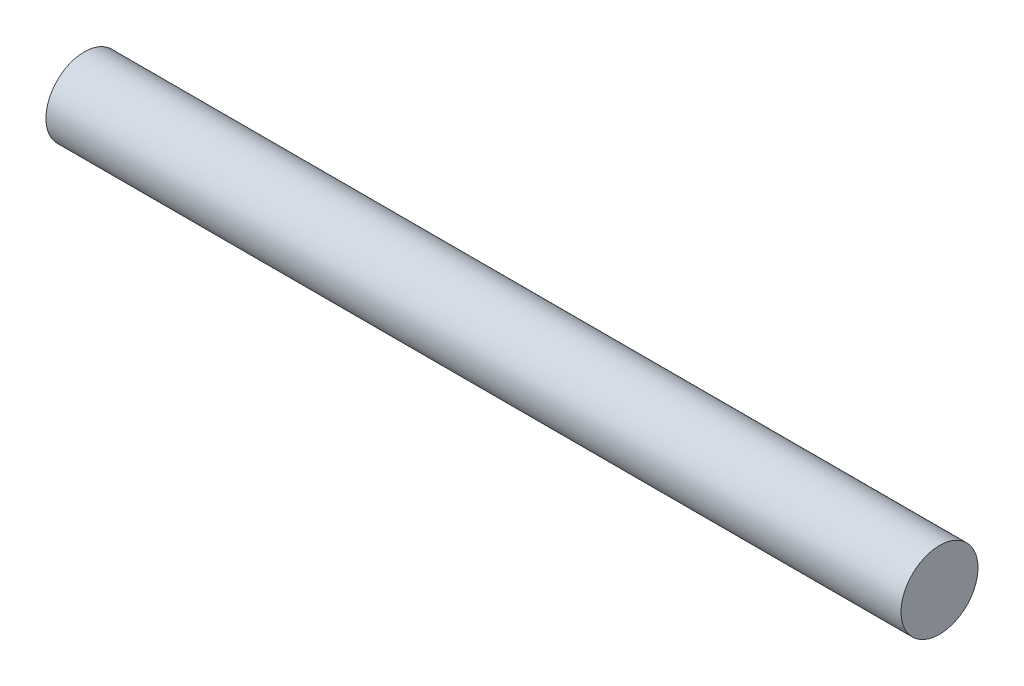
ISO-10303-21;
HEADER;
FILE_DESCRIPTION(('STEP AP214'),'2;1');
FILE_NAME('part.step','',(''),(''),'','','');
FILE_SCHEMA(('AUTOMOTIVE_DESIGN { 1 0 10303 214 1 1 1 1 }'));
ENDSEC;
DATA;
#1=APPLICATION_CONTEXT('core data for automotive mechanical design processes');
#2=APPLICATION_PROTOCOL_DEFINITION('international standard','automotive_design',2000,#1);
#3=PRODUCT_CONTEXT('',#1,'mechanical');
#4=PRODUCT('Part','Part','',(#3));
#5=PRODUCT_RELATED_PRODUCT_CATEGORY('part','',(#4));
#6=PRODUCT_DEFINITION_FORMATION('','',#4);
#7=PRODUCT_DEFINITION_CONTEXT('part definition',#1,'design');
#8=PRODUCT_DEFINITION('design','',#6,#7);
#9=PRODUCT_DEFINITION_SHAPE('','',#8);
#10=(LENGTH_UNIT() NAMED_UNIT(*) SI_UNIT(.MILLI.,.METRE.));
#11=(NAMED_UNIT(*) PLANE_ANGLE_UNIT() SI_UNIT($,.RADIAN.));
#12=(NAMED_UNIT(*) SI_UNIT($,.STERADIAN.) SOLID_ANGLE_UNIT());
#13=UNCERTAINTY_MEASURE_WITH_UNIT(LENGTH_MEASURE(1.E-05),#10,'distance_accuracy_value','');
#14=(GEOMETRIC_REPRESENTATION_CONTEXT(3) GLOBAL_UNCERTAINTY_ASSIGNED_CONTEXT((#13)) GLOBAL_UNIT_ASSIGNED_CONTEXT((#10,
#11,#12)) REPRESENTATION_CONTEXT('',''));
#15=CARTESIAN_POINT('',(0.,0.,0.));
#16=DIRECTION('',(0.,0.,1.));
#17=DIRECTION('',(1.,0.,0.));
#18=AXIS2_PLACEMENT_3D('',#15,#16,#17);
#19=CARTESIAN_POINT('',(1000.,0.,0.));
#20=DIRECTION('',(-1.,0.,0.));
#21=DIRECTION('',(0.,0.,1.));
#22=AXIS2_PLACEMENT_3D('',#19,#20,#21);
#23=CYLINDRICAL_SURFACE('',#22,45.);
#24=CARTESIAN_POINT('',(1000.,0.,0.));
#25=DIRECTION('',(1.,0.,0.));
#26=DIRECTION('',(0.,0.,-1.));
#27=AXIS2_PLACEMENT_3D('',#24,#25,#26);
#28=CIRCLE('',#27,45.);
#29=CARTESIAN_POINT('',(1000.,0.,-45.));
#30=VERTEX_POINT('',#29);
#31=EDGE_CURVE('E10',#30,#30,#28,.T.);
#32=ORIENTED_EDGE('',*,*,#31,.F.);
#33=EDGE_LOOP('',(#32));
#34=FACE_BOUND('',#33,.T.);
#35=CARTESIAN_POINT('',(0.,0.,0.));
#36=DIRECTION('',(1.,0.,0.));
#37=DIRECTION('',(0.,0.,-1.));
#38=AXIS2_PLACEMENT_3D('',#35,#36,#37);
#39=CIRCLE('',#38,45.);
#40=CARTESIAN_POINT('',(0.,0.,-45.));
#41=VERTEX_POINT('',#40);
#42=EDGE_CURVE('E44',#41,#41,#39,.T.);
#43=ORIENTED_EDGE('',*,*,#42,.T.);
#44=EDGE_LOOP('',(#43));
#45=FACE_BOUND('',#44,.T.);
#46=ADVANCED_FACE('F41',(#34,#45),#23,.T.);
#47=CARTESIAN_POINT('',(1000.,0.,0.));
#48=DIRECTION('',(1.,0.,0.));
#49=DIRECTION('',(0.,0.,-1.));
#50=AXIS2_PLACEMENT_3D('',#47,#48,#49);
#51=PLANE('',#50);
#52=ORIENTED_EDGE('',*,*,#31,.T.);
#53=EDGE_LOOP('',(#52));
#54=FACE_BOUND('',#53,.T.);
#55=ADVANCED_FACE('F58',(#54),#51,.T.);
#56=CARTESIAN_POINT('',(0.,0.,0.));
#57=DIRECTION('',(1.,0.,0.));
#58=DIRECTION('',(0.,0.,-1.));
#59=AXIS2_PLACEMENT_3D('',#56,#57,#58);
#60=PLANE('',#59);
#61=ORIENTED_EDGE('',*,*,#42,.F.);
#62=EDGE_LOOP('',(#61));
#63=FACE_BOUND('',#62,.T.);
#64=ADVANCED_FACE('F56',(#63),#60,.F.);
#65=CLOSED_SHELL('',(#46,#55,#64));
#66=MANIFOLD_SOLID_BREP('B2',#65);
#67=ADVANCED_BREP_SHAPE_REPRESENTATION('',(#18,#66),#14);
#68=SHAPE_DEFINITION_REPRESENTATION(#9,#67);
ENDSEC;
END-ISO-10303-21;
